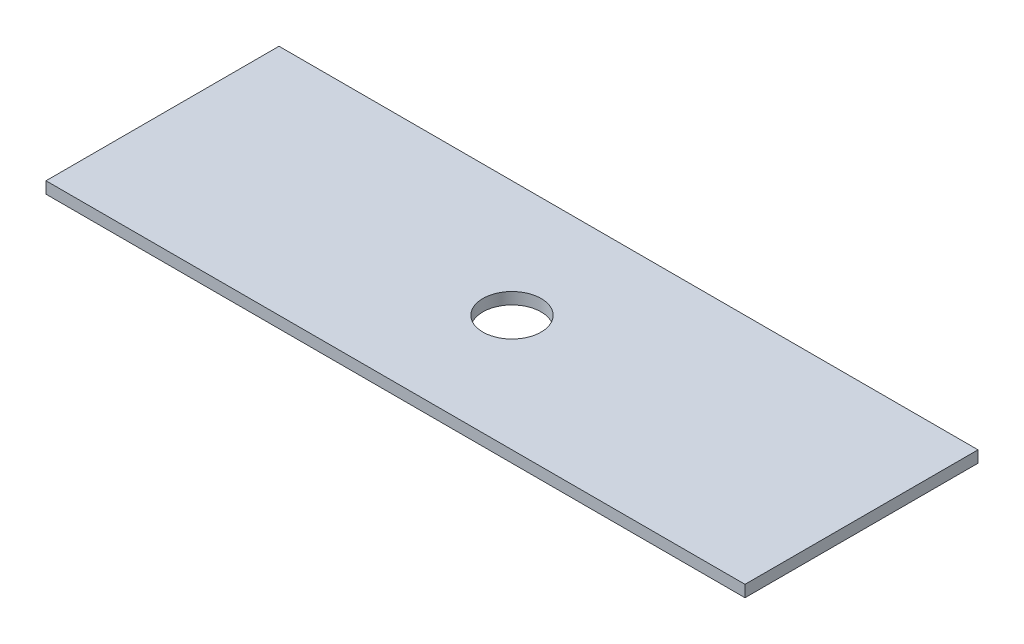
ISO-10303-21;
HEADER;
FILE_DESCRIPTION(('STEP AP214'),'2;1');
FILE_NAME('part.step','',(''),(''),'','','');
FILE_SCHEMA(('AUTOMOTIVE_DESIGN { 1 0 10303 214 1 1 1 1 }'));
ENDSEC;
DATA;
#1=APPLICATION_CONTEXT('core data for automotive mechanical design processes');
#2=APPLICATION_PROTOCOL_DEFINITION('international standard','automotive_design',2000,#1);
#3=PRODUCT_CONTEXT('',#1,'mechanical');
#4=PRODUCT('Part','Part','',(#3));
#5=PRODUCT_RELATED_PRODUCT_CATEGORY('part','',(#4));
#6=PRODUCT_DEFINITION_FORMATION('','',#4);
#7=PRODUCT_DEFINITION_CONTEXT('part definition',#1,'design');
#8=PRODUCT_DEFINITION('design','',#6,#7);
#9=PRODUCT_DEFINITION_SHAPE('','',#8);
#10=(LENGTH_UNIT() NAMED_UNIT(*) SI_UNIT(.MILLI.,.METRE.));
#11=(NAMED_UNIT(*) PLANE_ANGLE_UNIT() SI_UNIT($,.RADIAN.));
#12=(NAMED_UNIT(*) SI_UNIT($,.STERADIAN.) SOLID_ANGLE_UNIT());
#13=UNCERTAINTY_MEASURE_WITH_UNIT(LENGTH_MEASURE(1.E-05),#10,'distance_accuracy_value','');
#14=(GEOMETRIC_REPRESENTATION_CONTEXT(3) GLOBAL_UNCERTAINTY_ASSIGNED_CONTEXT((#13)) GLOBAL_UNIT_ASSIGNED_CONTEXT((#10,
#11,#12)) REPRESENTATION_CONTEXT('',''));
#15=CARTESIAN_POINT('',(0.,0.,0.));
#16=DIRECTION('',(0.,0.,1.));
#17=DIRECTION('',(1.,0.,0.));
#18=AXIS2_PLACEMENT_3D('',#15,#16,#17);
#19=CARTESIAN_POINT('',(0.,2.54,0.));
#20=DIRECTION('',(0.,-1.,0.));
#21=DIRECTION('',(0.,0.,-1.));
#22=AXIS2_PLACEMENT_3D('',#19,#20,#21);
#23=PLANE('',#22);
#24=DIRECTION('',(0.,0.,1.));
#25=VECTOR('',#24,1.);
#26=CARTESIAN_POINT('',(0.,2.54,0.));
#27=LINE('',#26,#25);
#28=CARTESIAN_POINT('',(0.,2.54,-50.8));
#29=VERTEX_POINT('',#28);
#30=CARTESIAN_POINT('',(0.,2.54,0.));
#31=VERTEX_POINT('',#30);
#32=EDGE_CURVE('E85',#29,#31,#27,.T.);
#33=ORIENTED_EDGE('',*,*,#32,.T.);
#34=DIRECTION('',(1.,0.,0.));
#35=VECTOR('',#34,1.);
#36=CARTESIAN_POINT('',(0.,2.54,0.));
#37=LINE('',#36,#35);
#38=CARTESIAN_POINT('',(152.4,2.54,0.));
#39=VERTEX_POINT('',#38);
#40=EDGE_CURVE('E80',#31,#39,#37,.T.);
#41=ORIENTED_EDGE('',*,*,#40,.T.);
#42=DIRECTION('',(0.,0.,-1.));
#43=VECTOR('',#42,1.);
#44=CARTESIAN_POINT('',(152.4,2.54,0.));
#45=LINE('',#44,#43);
#46=CARTESIAN_POINT('',(152.4,2.54,-50.8));
#47=VERTEX_POINT('',#46);
#48=EDGE_CURVE('E83',#39,#47,#45,.T.);
#49=ORIENTED_EDGE('',*,*,#48,.T.);
#50=DIRECTION('',(-1.,0.,0.));
#51=VECTOR('',#50,1.);
#52=CARTESIAN_POINT('',(0.,2.54,-50.8));
#53=LINE('',#52,#51);
#54=EDGE_CURVE('E50',#47,#29,#53,.T.);
#55=ORIENTED_EDGE('',*,*,#54,.T.);
#56=EDGE_LOOP('',(#33,#41,#49,#55));
#57=FACE_BOUND('',#56,.T.);
#58=CARTESIAN_POINT('',(76.2,2.54,-25.4));
#59=DIRECTION('',(0.,1.,0.));
#60=DIRECTION('',(0.,0.,1.));
#61=AXIS2_PLACEMENT_3D('',#58,#59,#60);
#62=CIRCLE('',#61,6.35);
#63=CARTESIAN_POINT('',(76.2,2.54,-19.05));
#64=VERTEX_POINT('',#63);
#65=EDGE_CURVE('E100',#64,#64,#62,.T.);
#66=ORIENTED_EDGE('',*,*,#65,.F.);
#67=EDGE_LOOP('',(#66));
#68=FACE_BOUND('',#67,.T.);
#69=ADVANCED_FACE('F33',(#57,#68),#23,.F.);
#70=CARTESIAN_POINT('',(0.,0.,0.));
#71=DIRECTION('',(0.,-1.,0.));
#72=DIRECTION('',(0.,0.,-1.));
#73=AXIS2_PLACEMENT_3D('',#70,#71,#72);
#74=PLANE('',#73);
#75=DIRECTION('',(0.,0.,1.));
#76=VECTOR('',#75,1.);
#77=CARTESIAN_POINT('',(0.,0.,0.));
#78=LINE('',#77,#76);
#79=CARTESIAN_POINT('',(0.,0.,-50.8));
#80=VERTEX_POINT('',#79);
#81=CARTESIAN_POINT('',(0.,0.,0.));
#82=VERTEX_POINT('',#81);
#83=EDGE_CURVE('E97',#80,#82,#78,.T.);
#84=ORIENTED_EDGE('',*,*,#83,.F.);
#85=DIRECTION('',(-1.,0.,0.));
#86=VECTOR('',#85,1.);
#87=CARTESIAN_POINT('',(0.,0.,-50.8));
#88=LINE('',#87,#86);
#89=CARTESIAN_POINT('',(152.4,0.,-50.8));
#90=VERTEX_POINT('',#89);
#91=EDGE_CURVE('E73',#90,#80,#88,.T.);
#92=ORIENTED_EDGE('',*,*,#91,.F.);
#93=DIRECTION('',(0.,0.,-1.));
#94=VECTOR('',#93,1.);
#95=CARTESIAN_POINT('',(152.4,0.,0.));
#96=LINE('',#95,#94);
#97=CARTESIAN_POINT('',(152.4,0.,0.));
#98=VERTEX_POINT('',#97);
#99=EDGE_CURVE('E67',#98,#90,#96,.T.);
#100=ORIENTED_EDGE('',*,*,#99,.F.);
#101=DIRECTION('',(1.,0.,0.));
#102=VECTOR('',#101,1.);
#103=CARTESIAN_POINT('',(0.,0.,0.));
#104=LINE('',#103,#102);
#105=EDGE_CURVE('E89',#82,#98,#104,.T.);
#106=ORIENTED_EDGE('',*,*,#105,.F.);
#107=EDGE_LOOP('',(#84,#92,#100,#106));
#108=FACE_BOUND('',#107,.T.);
#109=CARTESIAN_POINT('',(76.2,0.,-25.4));
#110=DIRECTION('',(0.,1.,0.));
#111=DIRECTION('',(0.,0.,1.));
#112=AXIS2_PLACEMENT_3D('',#109,#110,#111);
#113=CIRCLE('',#112,6.35);
#114=CARTESIAN_POINT('',(76.2,0.,-19.05));
#115=VERTEX_POINT('',#114);
#116=EDGE_CURVE('E112',#115,#115,#113,.T.);
#117=ORIENTED_EDGE('',*,*,#116,.T.);
#118=EDGE_LOOP('',(#117));
#119=FACE_BOUND('',#118,.T.);
#120=ADVANCED_FACE('F108',(#108,#119),#74,.T.);
#121=CARTESIAN_POINT('',(0.,2.54,0.));
#122=DIRECTION('',(1.,0.,0.));
#123=DIRECTION('',(0.,0.,-1.));
#124=AXIS2_PLACEMENT_3D('',#121,#122,#123);
#125=PLANE('',#124);
#126=ORIENTED_EDGE('',*,*,#83,.T.);
#127=DIRECTION('',(0.,-1.,0.));
#128=VECTOR('',#127,1.);
#129=CARTESIAN_POINT('',(0.,2.54,0.));
#130=LINE('',#129,#128);
#131=EDGE_CURVE('E11',#31,#82,#130,.T.);
#132=ORIENTED_EDGE('',*,*,#131,.F.);
#133=ORIENTED_EDGE('',*,*,#32,.F.);
#134=DIRECTION('',(0.,-1.,0.));
#135=VECTOR('',#134,1.);
#136=CARTESIAN_POINT('',(0.,2.54,-50.8));
#137=LINE('',#136,#135);
#138=EDGE_CURVE('E93',#29,#80,#137,.T.);
#139=ORIENTED_EDGE('',*,*,#138,.T.);
#140=EDGE_LOOP('',(#126,#132,#133,#139));
#141=FACE_BOUND('',#140,.T.);
#142=ADVANCED_FACE('F35',(#141),#125,.F.);
#143=CARTESIAN_POINT('',(0.,2.54,0.));
#144=DIRECTION('',(0.,0.,-1.));
#145=DIRECTION('',(-1.,0.,0.));
#146=AXIS2_PLACEMENT_3D('',#143,#144,#145);
#147=PLANE('',#146);
#148=ORIENTED_EDGE('',*,*,#105,.T.);
#149=DIRECTION('',(0.,-1.,0.));
#150=VECTOR('',#149,1.);
#151=CARTESIAN_POINT('',(152.4,2.54,0.));
#152=LINE('',#151,#150);
#153=EDGE_CURVE('E42',#39,#98,#152,.T.);
#154=ORIENTED_EDGE('',*,*,#153,.F.);
#155=ORIENTED_EDGE('',*,*,#40,.F.);
#156=ORIENTED_EDGE('',*,*,#131,.T.);
#157=EDGE_LOOP('',(#148,#154,#155,#156));
#158=FACE_BOUND('',#157,.T.);
#159=ADVANCED_FACE('F88',(#158),#147,.F.);
#160=CARTESIAN_POINT('',(152.4,2.54,0.));
#161=DIRECTION('',(-1.,0.,0.));
#162=DIRECTION('',(0.,0.,1.));
#163=AXIS2_PLACEMENT_3D('',#160,#161,#162);
#164=PLANE('',#163);
#165=ORIENTED_EDGE('',*,*,#99,.T.);
#166=DIRECTION('',(0.,-1.,0.));
#167=VECTOR('',#166,1.);
#168=CARTESIAN_POINT('',(152.4,2.54,-50.8));
#169=LINE('',#168,#167);
#170=EDGE_CURVE('E90',#47,#90,#169,.T.);
#171=ORIENTED_EDGE('',*,*,#170,.F.);
#172=ORIENTED_EDGE('',*,*,#48,.F.);
#173=ORIENTED_EDGE('',*,*,#153,.T.);
#174=EDGE_LOOP('',(#165,#171,#172,#173));
#175=FACE_BOUND('',#174,.T.);
#176=ADVANCED_FACE('F91',(#175),#164,.F.);
#177=CARTESIAN_POINT('',(0.,2.54,-50.8));
#178=DIRECTION('',(0.,0.,1.));
#179=DIRECTION('',(1.,0.,0.));
#180=AXIS2_PLACEMENT_3D('',#177,#178,#179);
#181=PLANE('',#180);
#182=ORIENTED_EDGE('',*,*,#91,.T.);
#183=ORIENTED_EDGE('',*,*,#138,.F.);
#184=ORIENTED_EDGE('',*,*,#54,.F.);
#185=ORIENTED_EDGE('',*,*,#170,.T.);
#186=EDGE_LOOP('',(#182,#183,#184,#185));
#187=FACE_BOUND('',#186,.T.);
#188=ADVANCED_FACE('F105',(#187),#181,.F.);
#189=CARTESIAN_POINT('',(76.2,2.54,-25.4));
#190=DIRECTION('',(0.,-1.,0.));
#191=DIRECTION('',(0.,0.,-1.));
#192=AXIS2_PLACEMENT_3D('',#189,#190,#191);
#193=CYLINDRICAL_SURFACE('',#192,6.35);
#194=ORIENTED_EDGE('',*,*,#65,.T.);
#195=EDGE_LOOP('',(#194));
#196=FACE_BOUND('',#195,.T.);
#197=ORIENTED_EDGE('',*,*,#116,.F.);
#198=EDGE_LOOP('',(#197));
#199=FACE_BOUND('',#198,.T.);
#200=ADVANCED_FACE('F118',(#196,#199),#193,.F.);
#201=CLOSED_SHELL('',(#69,#120,#142,#159,#176,#188,#200));
#202=MANIFOLD_SOLID_BREP('B2',#201);
#203=ADVANCED_BREP_SHAPE_REPRESENTATION('',(#18,#202),#14);
#204=SHAPE_DEFINITION_REPRESENTATION(#9,#203);
ENDSEC;
END-ISO-10303-21;
